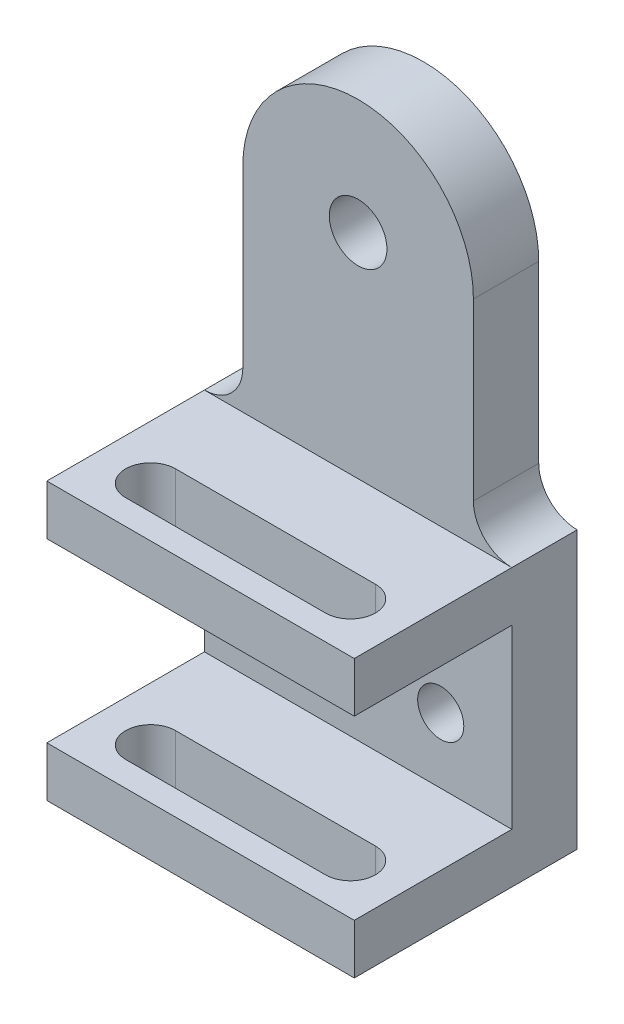
ISO-10303-21;
HEADER;
FILE_DESCRIPTION(('STEP AP214'),'2;1');
FILE_NAME('part.step','',(''),(''),'','','');
FILE_SCHEMA(('AUTOMOTIVE_DESIGN { 1 0 10303 214 1 1 1 1 }'));
ENDSEC;
DATA;
#1=APPLICATION_CONTEXT('core data for automotive mechanical design processes');
#2=APPLICATION_PROTOCOL_DEFINITION('international standard','automotive_design',2000,#1);
#3=PRODUCT_CONTEXT('',#1,'mechanical');
#4=PRODUCT('Part','Part','',(#3));
#5=PRODUCT_RELATED_PRODUCT_CATEGORY('part','',(#4));
#6=PRODUCT_DEFINITION_FORMATION('','',#4);
#7=PRODUCT_DEFINITION_CONTEXT('part definition',#1,'design');
#8=PRODUCT_DEFINITION('design','',#6,#7);
#9=PRODUCT_DEFINITION_SHAPE('','',#8);
#10=(LENGTH_UNIT() NAMED_UNIT(*) SI_UNIT(.MILLI.,.METRE.));
#11=(NAMED_UNIT(*) PLANE_ANGLE_UNIT() SI_UNIT($,.RADIAN.));
#12=(NAMED_UNIT(*) SI_UNIT($,.STERADIAN.) SOLID_ANGLE_UNIT());
#13=UNCERTAINTY_MEASURE_WITH_UNIT(LENGTH_MEASURE(1.E-05),#10,'distance_accuracy_value','');
#14=(GEOMETRIC_REPRESENTATION_CONTEXT(3) GLOBAL_UNCERTAINTY_ASSIGNED_CONTEXT((#13)) GLOBAL_UNIT_ASSIGNED_CONTEXT((#10,
#11,#12)) REPRESENTATION_CONTEXT('',''));
#15=CARTESIAN_POINT('',(0.,0.,0.));
#16=DIRECTION('',(0.,0.,1.));
#17=DIRECTION('',(1.,0.,0.));
#18=AXIS2_PLACEMENT_3D('',#15,#16,#17);
#19=CARTESIAN_POINT('',(40.,82.,-67.5));
#20=DIRECTION('',(0.,0.,1.));
#21=DIRECTION('',(1.,0.,0.));
#22=AXIS2_PLACEMENT_3D('',#19,#20,#21);
#23=CYLINDRICAL_SURFACE('',#22,10.);
#24=DIRECTION('',(0.,0.,-1.));
#25=VECTOR('',#24,1.);
#26=CARTESIAN_POINT('',(30.,82.,-67.5));
#27=LINE('',#26,#25);
#28=CARTESIAN_POINT('',(30.,82.,-12.));
#29=VERTEX_POINT('',#28);
#30=CARTESIAN_POINT('',(30.,82.,-29.));
#31=VERTEX_POINT('',#30);
#32=EDGE_CURVE('E377',#29,#31,#27,.T.);
#33=ORIENTED_EDGE('',*,*,#32,.F.);
#34=CARTESIAN_POINT('',(40.,82.,-12.));
#35=DIRECTION('',(0.,0.,-1.));
#36=DIRECTION('',(-1.,0.,0.));
#37=AXIS2_PLACEMENT_3D('',#34,#35,#36);
#38=CIRCLE('',#37,10.);
#39=CARTESIAN_POINT('',(40.,72.,-12.));
#40=VERTEX_POINT('',#39);
#41=EDGE_CURVE('E381',#29,#40,#38,.F.);
#42=ORIENTED_EDGE('',*,*,#41,.T.);
#43=DIRECTION('',(0.,0.,1.));
#44=VECTOR('',#43,1.);
#45=CARTESIAN_POINT('',(40.,72.,-29.));
#46=LINE('',#45,#44);
#47=CARTESIAN_POINT('',(40.,72.,-29.));
#48=VERTEX_POINT('',#47);
#49=EDGE_CURVE('E313',#48,#40,#46,.T.);
#50=ORIENTED_EDGE('',*,*,#49,.F.);
#51=CARTESIAN_POINT('',(40.,82.,-29.));
#52=DIRECTION('',(0.,0.,1.));
#53=DIRECTION('',(1.,0.,0.));
#54=AXIS2_PLACEMENT_3D('',#51,#52,#53);
#55=CIRCLE('',#54,10.);
#56=EDGE_CURVE('E385',#48,#31,#55,.F.);
#57=ORIENTED_EDGE('',*,*,#56,.T.);
#58=EDGE_LOOP('',(#33,#42,#50,#57));
#59=FACE_BOUND('',#58,.T.);
#60=ADVANCED_FACE('F39',(#59),#23,.F.);
#61=CARTESIAN_POINT('',(-40.,82.,-67.5));
#62=DIRECTION('',(0.,0.,-1.));
#63=DIRECTION('',(-1.,0.,0.));
#64=AXIS2_PLACEMENT_3D('',#61,#62,#63);
#65=CYLINDRICAL_SURFACE('',#64,10.);
#66=DIRECTION('',(0.,0.,1.));
#67=VECTOR('',#66,1.);
#68=CARTESIAN_POINT('',(-30.,82.,-67.5));
#69=LINE('',#68,#67);
#70=CARTESIAN_POINT('',(-30.,82.,-29.));
#71=VERTEX_POINT('',#70);
#72=CARTESIAN_POINT('',(-30.,82.,-12.));
#73=VERTEX_POINT('',#72);
#74=EDGE_CURVE('E367',#71,#73,#69,.T.);
#75=ORIENTED_EDGE('',*,*,#74,.F.);
#76=CARTESIAN_POINT('',(-40.,82.,-29.));
#77=DIRECTION('',(0.,0.,1.));
#78=DIRECTION('',(1.,0.,0.));
#79=AXIS2_PLACEMENT_3D('',#76,#77,#78);
#80=CIRCLE('',#79,10.);
#81=CARTESIAN_POINT('',(-40.,72.,-29.));
#82=VERTEX_POINT('',#81);
#83=EDGE_CURVE('E371',#71,#82,#80,.F.);
#84=ORIENTED_EDGE('',*,*,#83,.T.);
#85=DIRECTION('',(0.,0.,1.));
#86=VECTOR('',#85,1.);
#87=CARTESIAN_POINT('',(-40.,72.,-29.));
#88=LINE('',#87,#86);
#89=CARTESIAN_POINT('',(-40.,72.,-12.));
#90=VERTEX_POINT('',#89);
#91=EDGE_CURVE('E307',#82,#90,#88,.T.);
#92=ORIENTED_EDGE('',*,*,#91,.T.);
#93=CARTESIAN_POINT('',(-40.,82.,-12.));
#94=DIRECTION('',(0.,0.,-1.));
#95=DIRECTION('',(-1.,0.,0.));
#96=AXIS2_PLACEMENT_3D('',#93,#94,#95);
#97=CIRCLE('',#96,10.);
#98=EDGE_CURVE('E374',#90,#73,#97,.F.);
#99=ORIENTED_EDGE('',*,*,#98,.T.);
#100=EDGE_LOOP('',(#75,#84,#92,#99));
#101=FACE_BOUND('',#100,.T.);
#102=ADVANCED_FACE('F482',(#101),#65,.F.);
#103=CARTESIAN_POINT('',(-40.,13.,-29.));
#104=DIRECTION('',(0.,0.,1.));
#105=DIRECTION('',(1.,0.,0.));
#106=AXIS2_PLACEMENT_3D('',#103,#104,#105);
#107=PLANE('',#106);
#108=CARTESIAN_POINT('',(21.5,30.,-29.));
#109=DIRECTION('',(0.,0.,1.));
#110=DIRECTION('',(1.,0.,0.));
#111=AXIS2_PLACEMENT_3D('',#108,#109,#110);
#112=CIRCLE('',#111,6.);
#113=CARTESIAN_POINT('',(27.5,30.,-29.));
#114=VERTEX_POINT('',#113);
#115=EDGE_CURVE('E425',#114,#114,#112,.T.);
#116=ORIENTED_EDGE('',*,*,#115,.T.);
#117=EDGE_LOOP('',(#116));
#118=FACE_BOUND('',#117,.T.);
#119=CARTESIAN_POINT('',(-21.5,30.,-29.));
#120=DIRECTION('',(0.,0.,1.));
#121=DIRECTION('',(1.,0.,0.));
#122=AXIS2_PLACEMENT_3D('',#119,#120,#121);
#123=CIRCLE('',#122,6.);
#124=CARTESIAN_POINT('',(-15.5,30.,-29.));
#125=VERTEX_POINT('',#124);
#126=EDGE_CURVE('E417',#125,#125,#123,.T.);
#127=ORIENTED_EDGE('',*,*,#126,.T.);
#128=EDGE_LOOP('',(#127));
#129=FACE_BOUND('',#128,.T.);
#130=CARTESIAN_POINT('',(0.,127.5,-29.));
#131=DIRECTION('',(0.,0.,1.));
#132=DIRECTION('',(1.,0.,0.));
#133=AXIS2_PLACEMENT_3D('',#130,#131,#132);
#134=CIRCLE('',#133,7.5);
#135=CARTESIAN_POINT('',(7.49999999999999,127.5,-29.));
#136=VERTEX_POINT('',#135);
#137=EDGE_CURVE('E246',#136,#136,#134,.T.);
#138=ORIENTED_EDGE('',*,*,#137,.T.);
#139=EDGE_LOOP('',(#138));
#140=FACE_BOUND('',#139,.T.);
#141=DIRECTION('',(0.,-1.,0.));
#142=VECTOR('',#141,1.);
#143=CARTESIAN_POINT('',(-30.,13.,-29.));
#144=LINE('',#143,#142);
#145=CARTESIAN_POINT('',(-30.,127.5,-29.));
#146=VERTEX_POINT('',#145);
#147=EDGE_CURVE('E274',#146,#71,#144,.T.);
#148=ORIENTED_EDGE('',*,*,#147,.F.);
#149=CARTESIAN_POINT('',(0.,127.5,-29.));
#150=DIRECTION('',(0.,0.,1.));
#151=DIRECTION('',(1.,0.,0.));
#152=AXIS2_PLACEMENT_3D('',#149,#150,#151);
#153=CIRCLE('',#152,30.);
#154=CARTESIAN_POINT('',(30.,127.5,-29.));
#155=VERTEX_POINT('',#154);
#156=EDGE_CURVE('E254',#155,#146,#153,.T.);
#157=ORIENTED_EDGE('',*,*,#156,.F.);
#158=DIRECTION('',(0.,1.,0.));
#159=VECTOR('',#158,1.);
#160=CARTESIAN_POINT('',(30.,13.,-29.));
#161=LINE('',#160,#159);
#162=EDGE_CURVE('E267',#31,#155,#161,.T.);
#163=ORIENTED_EDGE('',*,*,#162,.F.);
#164=ORIENTED_EDGE('',*,*,#56,.F.);
#165=DIRECTION('',(0.,-1.,0.));
#166=VECTOR('',#165,1.);
#167=CARTESIAN_POINT('',(40.,13.,-29.));
#168=LINE('',#167,#166);
#169=CARTESIAN_POINT('',(40.,0.,-29.));
#170=VERTEX_POINT('',#169);
#171=EDGE_CURVE('E361',#48,#170,#168,.T.);
#172=ORIENTED_EDGE('',*,*,#171,.T.);
#173=DIRECTION('',(-1.,0.,0.));
#174=VECTOR('',#173,1.);
#175=CARTESIAN_POINT('',(-40.,0.,-29.));
#176=LINE('',#175,#174);
#177=CARTESIAN_POINT('',(-40.,0.,-29.));
#178=VERTEX_POINT('',#177);
#179=EDGE_CURVE('E342',#170,#178,#176,.T.);
#180=ORIENTED_EDGE('',*,*,#179,.T.);
#181=DIRECTION('',(0.,-1.,0.));
#182=VECTOR('',#181,1.);
#183=CARTESIAN_POINT('',(-40.,13.,-29.));
#184=LINE('',#183,#182);
#185=EDGE_CURVE('E358',#82,#178,#184,.T.);
#186=ORIENTED_EDGE('',*,*,#185,.F.);
#187=ORIENTED_EDGE('',*,*,#83,.F.);
#188=EDGE_LOOP('',(#148,#157,#163,#164,#172,#180,#186,#187));
#189=FACE_BOUND('',#188,.T.);
#190=ADVANCED_FACE('F435',(#118,#129,#140,#189),#107,.F.);
#191=CARTESIAN_POINT('',(-40.,127.5,-12.));
#192=DIRECTION('',(0.,0.,-1.));
#193=DIRECTION('',(-1.,0.,0.));
#194=AXIS2_PLACEMENT_3D('',#191,#192,#193);
#195=PLANE('',#194);
#196=CARTESIAN_POINT('',(0.,127.5,-12.));
#197=DIRECTION('',(0.,0.,1.));
#198=DIRECTION('',(1.,0.,0.));
#199=AXIS2_PLACEMENT_3D('',#196,#197,#198);
#200=CIRCLE('',#199,7.5);
#201=CARTESIAN_POINT('',(7.49999999999999,127.5,-12.));
#202=VERTEX_POINT('',#201);
#203=EDGE_CURVE('E236',#202,#202,#200,.T.);
#204=ORIENTED_EDGE('',*,*,#203,.F.);
#205=EDGE_LOOP('',(#204));
#206=FACE_BOUND('',#205,.T.);
#207=DIRECTION('',(1.,0.,0.));
#208=VECTOR('',#207,1.);
#209=CARTESIAN_POINT('',(-40.,72.,-12.));
#210=LINE('',#209,#208);
#211=EDGE_CURVE('E278',#90,#40,#210,.T.);
#212=ORIENTED_EDGE('',*,*,#211,.T.);
#213=ORIENTED_EDGE('',*,*,#41,.F.);
#214=DIRECTION('',(0.,1.,0.));
#215=VECTOR('',#214,1.);
#216=CARTESIAN_POINT('',(30.,72.,-12.));
#217=LINE('',#216,#215);
#218=CARTESIAN_POINT('',(30.,127.5,-12.));
#219=VERTEX_POINT('',#218);
#220=EDGE_CURVE('E257',#29,#219,#217,.T.);
#221=ORIENTED_EDGE('',*,*,#220,.T.);
#222=CARTESIAN_POINT('',(0.,127.5,-12.));
#223=DIRECTION('',(0.,0.,1.));
#224=DIRECTION('',(1.,0.,0.));
#225=AXIS2_PLACEMENT_3D('',#222,#223,#224);
#226=CIRCLE('',#225,30.);
#227=CARTESIAN_POINT('',(-30.,127.5,-12.));
#228=VERTEX_POINT('',#227);
#229=EDGE_CURVE('E250',#219,#228,#226,.T.);
#230=ORIENTED_EDGE('',*,*,#229,.T.);
#231=DIRECTION('',(0.,-1.,0.));
#232=VECTOR('',#231,1.);
#233=CARTESIAN_POINT('',(-30.,127.5,-12.));
#234=LINE('',#233,#232);
#235=EDGE_CURVE('E270',#228,#73,#234,.T.);
#236=ORIENTED_EDGE('',*,*,#235,.T.);
#237=ORIENTED_EDGE('',*,*,#98,.F.);
#238=EDGE_LOOP('',(#212,#213,#221,#230,#236,#237));
#239=FACE_BOUND('',#238,.T.);
#240=ADVANCED_FACE('F501',(#206,#239),#195,.F.);
#241=CARTESIAN_POINT('',(40.,13.,-29.));
#242=DIRECTION('',(-1.,0.,0.));
#243=DIRECTION('',(0.,0.,1.));
#244=AXIS2_PLACEMENT_3D('',#241,#242,#243);
#245=PLANE('',#244);
#246=ORIENTED_EDGE('',*,*,#171,.F.);
#247=ORIENTED_EDGE('',*,*,#49,.T.);
#248=CARTESIAN_POINT('',(40.,72.,29.));
#249=VERTEX_POINT('',#248);
#250=EDGE_CURVE('E311',#40,#249,#46,.T.);
#251=ORIENTED_EDGE('',*,*,#250,.T.);
#252=DIRECTION('',(0.,-1.,0.));
#253=VECTOR('',#252,1.);
#254=CARTESIAN_POINT('',(40.,72.,29.));
#255=LINE('',#254,#253);
#256=CARTESIAN_POINT('',(40.,59.,29.));
#257=VERTEX_POINT('',#256);
#258=EDGE_CURVE('E289',#249,#257,#255,.T.);
#259=ORIENTED_EDGE('',*,*,#258,.T.);
#260=DIRECTION('',(0.,0.,-1.));
#261=VECTOR('',#260,1.);
#262=CARTESIAN_POINT('',(40.,59.,29.));
#263=LINE('',#262,#261);
#264=CARTESIAN_POINT('',(40.,59.,-12.));
#265=VERTEX_POINT('',#264);
#266=EDGE_CURVE('E297',#257,#265,#263,.T.);
#267=ORIENTED_EDGE('',*,*,#266,.T.);
#268=DIRECTION('',(0.,-1.,0.));
#269=VECTOR('',#268,1.);
#270=CARTESIAN_POINT('',(40.,72.,-12.));
#271=LINE('',#270,#269);
#272=CARTESIAN_POINT('',(40.,13.,-12.));
#273=VERTEX_POINT('',#272);
#274=EDGE_CURVE('E317',#265,#273,#271,.T.);
#275=ORIENTED_EDGE('',*,*,#274,.T.);
#276=DIRECTION('',(0.,0.,-1.));
#277=VECTOR('',#276,1.);
#278=CARTESIAN_POINT('',(40.,13.,-29.));
#279=LINE('',#278,#277);
#280=CARTESIAN_POINT('',(40.,13.,29.));
#281=VERTEX_POINT('',#280);
#282=EDGE_CURVE('E327',#281,#273,#279,.T.);
#283=ORIENTED_EDGE('',*,*,#282,.F.);
#284=DIRECTION('',(0.,-1.,0.));
#285=VECTOR('',#284,1.);
#286=CARTESIAN_POINT('',(40.,13.,29.));
#287=LINE('',#286,#285);
#288=CARTESIAN_POINT('',(40.,0.,29.));
#289=VERTEX_POINT('',#288);
#290=EDGE_CURVE('E338',#281,#289,#287,.T.);
#291=ORIENTED_EDGE('',*,*,#290,.T.);
#292=DIRECTION('',(0.,0.,-1.));
#293=VECTOR('',#292,1.);
#294=CARTESIAN_POINT('',(40.,0.,-29.));
#295=LINE('',#294,#293);
#296=EDGE_CURVE('E326',#289,#170,#295,.T.);
#297=ORIENTED_EDGE('',*,*,#296,.T.);
#298=EDGE_LOOP('',(#246,#247,#251,#259,#267,#275,#283,#291,#297));
#299=FACE_BOUND('',#298,.T.);
#300=ADVANCED_FACE('F471',(#299),#245,.F.);
#301=CARTESIAN_POINT('',(-40.,13.,-29.));
#302=DIRECTION('',(1.,0.,0.));
#303=DIRECTION('',(0.,0.,-1.));
#304=AXIS2_PLACEMENT_3D('',#301,#302,#303);
#305=PLANE('',#304);
#306=ORIENTED_EDGE('',*,*,#91,.F.);
#307=ORIENTED_EDGE('',*,*,#185,.T.);
#308=DIRECTION('',(0.,0.,1.));
#309=VECTOR('',#308,1.);
#310=CARTESIAN_POINT('',(-40.,0.,-29.));
#311=LINE('',#310,#309);
#312=CARTESIAN_POINT('',(-40.,0.,29.));
#313=VERTEX_POINT('',#312);
#314=EDGE_CURVE('E346',#178,#313,#311,.T.);
#315=ORIENTED_EDGE('',*,*,#314,.T.);
#316=DIRECTION('',(0.,-1.,0.));
#317=VECTOR('',#316,1.);
#318=CARTESIAN_POINT('',(-40.,13.,29.));
#319=LINE('',#318,#317);
#320=CARTESIAN_POINT('',(-40.,13.,29.));
#321=VERTEX_POINT('',#320);
#322=EDGE_CURVE('E354',#321,#313,#319,.T.);
#323=ORIENTED_EDGE('',*,*,#322,.F.);
#324=DIRECTION('',(0.,0.,1.));
#325=VECTOR('',#324,1.);
#326=CARTESIAN_POINT('',(-40.,13.,-29.));
#327=LINE('',#326,#325);
#328=CARTESIAN_POINT('',(-40.,13.,-12.));
#329=VERTEX_POINT('',#328);
#330=EDGE_CURVE('E331',#329,#321,#327,.T.);
#331=ORIENTED_EDGE('',*,*,#330,.F.);
#332=DIRECTION('',(0.,-1.,0.));
#333=VECTOR('',#332,1.);
#334=CARTESIAN_POINT('',(-40.,72.,-12.));
#335=LINE('',#334,#333);
#336=CARTESIAN_POINT('',(-40.,59.,-12.));
#337=VERTEX_POINT('',#336);
#338=EDGE_CURVE('E323',#337,#329,#335,.T.);
#339=ORIENTED_EDGE('',*,*,#338,.F.);
#340=DIRECTION('',(0.,0.,-1.));
#341=VECTOR('',#340,1.);
#342=CARTESIAN_POINT('',(-40.,59.,29.));
#343=LINE('',#342,#341);
#344=CARTESIAN_POINT('',(-40.,59.,29.));
#345=VERTEX_POINT('',#344);
#346=EDGE_CURVE('E303',#345,#337,#343,.T.);
#347=ORIENTED_EDGE('',*,*,#346,.F.);
#348=DIRECTION('',(0.,-1.,0.));
#349=VECTOR('',#348,1.);
#350=CARTESIAN_POINT('',(-40.,72.,29.));
#351=LINE('',#350,#349);
#352=CARTESIAN_POINT('',(-40.,72.,29.));
#353=VERTEX_POINT('',#352);
#354=EDGE_CURVE('E282',#353,#345,#351,.T.);
#355=ORIENTED_EDGE('',*,*,#354,.F.);
#356=EDGE_CURVE('E312',#90,#353,#88,.T.);
#357=ORIENTED_EDGE('',*,*,#356,.F.);
#358=EDGE_LOOP('',(#306,#307,#315,#323,#331,#339,#347,#355,#357));
#359=FACE_BOUND('',#358,.T.);
#360=ADVANCED_FACE('F449',(#359),#305,.F.);
#361=CARTESIAN_POINT('',(-40.,72.,-12.));
#362=DIRECTION('',(0.,0.,-1.));
#363=DIRECTION('',(-1.,0.,0.));
#364=AXIS2_PLACEMENT_3D('',#361,#362,#363);
#365=PLANE('',#364);
#366=CARTESIAN_POINT('',(21.5,30.,-12.));
#367=DIRECTION('',(0.,0.,1.));
#368=DIRECTION('',(1.,0.,0.));
#369=AXIS2_PLACEMENT_3D('',#366,#367,#368);
#370=CIRCLE('',#369,6.);
#371=CARTESIAN_POINT('',(27.5,30.,-12.));
#372=VERTEX_POINT('',#371);
#373=EDGE_CURVE('E427',#372,#372,#370,.T.);
#374=ORIENTED_EDGE('',*,*,#373,.F.);
#375=EDGE_LOOP('',(#374));
#376=FACE_BOUND('',#375,.T.);
#377=CARTESIAN_POINT('',(-21.5,30.,-12.));
#378=DIRECTION('',(0.,0.,1.));
#379=DIRECTION('',(1.,0.,0.));
#380=AXIS2_PLACEMENT_3D('',#377,#378,#379);
#381=CIRCLE('',#380,6.);
#382=CARTESIAN_POINT('',(-15.5,30.,-12.));
#383=VERTEX_POINT('',#382);
#384=EDGE_CURVE('E420',#383,#383,#381,.T.);
#385=ORIENTED_EDGE('',*,*,#384,.F.);
#386=EDGE_LOOP('',(#385));
#387=FACE_BOUND('',#386,.T.);
#388=DIRECTION('',(1.,0.,0.));
#389=VECTOR('',#388,1.);
#390=CARTESIAN_POINT('',(-40.,59.,-12.));
#391=LINE('',#390,#389);
#392=EDGE_CURVE('E281',#337,#265,#391,.T.);
#393=ORIENTED_EDGE('',*,*,#392,.F.);
#394=ORIENTED_EDGE('',*,*,#338,.T.);
#395=DIRECTION('',(1.,0.,0.));
#396=VECTOR('',#395,1.);
#397=CARTESIAN_POINT('',(-40.,13.,-12.));
#398=LINE('',#397,#396);
#399=EDGE_CURVE('E306',#329,#273,#398,.T.);
#400=ORIENTED_EDGE('',*,*,#399,.T.);
#401=ORIENTED_EDGE('',*,*,#274,.F.);
#402=EDGE_LOOP('',(#393,#394,#400,#401));
#403=FACE_BOUND('',#402,.T.);
#404=ADVANCED_FACE('F445',(#376,#387,#403),#365,.F.);
#405=CARTESIAN_POINT('',(-40.,13.,29.));
#406=DIRECTION('',(0.,0.,-1.));
#407=DIRECTION('',(-1.,0.,0.));
#408=AXIS2_PLACEMENT_3D('',#405,#406,#407);
#409=PLANE('',#408);
#410=DIRECTION('',(1.,0.,0.));
#411=VECTOR('',#410,1.);
#412=CARTESIAN_POINT('',(-40.,0.,29.));
#413=LINE('',#412,#411);
#414=EDGE_CURVE('E332',#313,#289,#413,.T.);
#415=ORIENTED_EDGE('',*,*,#414,.T.);
#416=ORIENTED_EDGE('',*,*,#290,.F.);
#417=DIRECTION('',(1.,0.,0.));
#418=VECTOR('',#417,1.);
#419=CARTESIAN_POINT('',(-40.,13.,29.));
#420=LINE('',#419,#418);
#421=EDGE_CURVE('E335',#321,#281,#420,.T.);
#422=ORIENTED_EDGE('',*,*,#421,.F.);
#423=ORIENTED_EDGE('',*,*,#322,.T.);
#424=EDGE_LOOP('',(#415,#416,#422,#423));
#425=FACE_BOUND('',#424,.T.);
#426=ADVANCED_FACE('F448',(#425),#409,.F.);
#427=CARTESIAN_POINT('',(0.,13.,0.));
#428=DIRECTION('',(0.,1.,0.));
#429=DIRECTION('',(0.,0.,1.));
#430=AXIS2_PLACEMENT_3D('',#427,#428,#429);
#431=PLANE('',#430);
#432=CARTESIAN_POINT('',(-26.,13.,16.));
#433=DIRECTION('',(0.,1.,0.));
#434=DIRECTION('',(0.,0.,1.));
#435=AXIS2_PLACEMENT_3D('',#432,#433,#434);
#436=CIRCLE('',#435,6.5);
#437=CARTESIAN_POINT('',(-26.,13.,9.5));
#438=VERTEX_POINT('',#437);
#439=CARTESIAN_POINT('',(-26.,13.,22.5));
#440=VERTEX_POINT('',#439);
#441=EDGE_CURVE('E213',#438,#440,#436,.T.);
#442=ORIENTED_EDGE('',*,*,#441,.F.);
#443=DIRECTION('',(1.,0.,0.));
#444=VECTOR('',#443,1.);
#445=CARTESIAN_POINT('',(-26.,13.,9.5));
#446=LINE('',#445,#444);
#447=CARTESIAN_POINT('',(26.,13.,9.5));
#448=VERTEX_POINT('',#447);
#449=EDGE_CURVE('E228',#438,#448,#446,.T.);
#450=ORIENTED_EDGE('',*,*,#449,.T.);
#451=CARTESIAN_POINT('',(26.,13.,16.));
#452=DIRECTION('',(0.,1.,0.));
#453=DIRECTION('',(0.,0.,1.));
#454=AXIS2_PLACEMENT_3D('',#451,#452,#453);
#455=CIRCLE('',#454,6.5);
#456=CARTESIAN_POINT('',(26.,13.,22.5));
#457=VERTEX_POINT('',#456);
#458=EDGE_CURVE('E224',#457,#448,#455,.T.);
#459=ORIENTED_EDGE('',*,*,#458,.F.);
#460=DIRECTION('',(1.,0.,0.));
#461=VECTOR('',#460,1.);
#462=CARTESIAN_POINT('',(-26.,13.,22.5));
#463=LINE('',#462,#461);
#464=EDGE_CURVE('E220',#440,#457,#463,.T.);
#465=ORIENTED_EDGE('',*,*,#464,.F.);
#466=EDGE_LOOP('',(#442,#450,#459,#465));
#467=FACE_BOUND('',#466,.T.);
#468=ORIENTED_EDGE('',*,*,#399,.F.);
#469=ORIENTED_EDGE('',*,*,#330,.T.);
#470=ORIENTED_EDGE('',*,*,#421,.T.);
#471=ORIENTED_EDGE('',*,*,#282,.T.);
#472=EDGE_LOOP('',(#468,#469,#470,#471));
#473=FACE_BOUND('',#472,.T.);
#474=ADVANCED_FACE('F466',(#467,#473),#431,.T.);
#475=CARTESIAN_POINT('',(0.,0.,0.));
#476=DIRECTION('',(0.,1.,0.));
#477=DIRECTION('',(0.,0.,1.));
#478=AXIS2_PLACEMENT_3D('',#475,#476,#477);
#479=PLANE('',#478);
#480=DIRECTION('',(1.,0.,0.));
#481=VECTOR('',#480,1.);
#482=CARTESIAN_POINT('',(0.,0.,9.5));
#483=LINE('',#482,#481);
#484=CARTESIAN_POINT('',(-26.,0.,9.5));
#485=VERTEX_POINT('',#484);
#486=CARTESIAN_POINT('',(26.,0.,9.5));
#487=VERTEX_POINT('',#486);
#488=EDGE_CURVE('E396',#485,#487,#483,.T.);
#489=ORIENTED_EDGE('',*,*,#488,.F.);
#490=CARTESIAN_POINT('',(-26.,0.,16.));
#491=DIRECTION('',(0.,1.,0.));
#492=DIRECTION('',(0.,0.,1.));
#493=AXIS2_PLACEMENT_3D('',#490,#491,#492);
#494=CIRCLE('',#493,6.5);
#495=CARTESIAN_POINT('',(-26.,0.,22.5));
#496=VERTEX_POINT('',#495);
#497=EDGE_CURVE('E399',#485,#496,#494,.T.);
#498=ORIENTED_EDGE('',*,*,#497,.T.);
#499=DIRECTION('',(1.,0.,0.));
#500=VECTOR('',#499,1.);
#501=CARTESIAN_POINT('',(0.,0.,22.5));
#502=LINE('',#501,#500);
#503=CARTESIAN_POINT('',(26.,0.,22.5));
#504=VERTEX_POINT('',#503);
#505=EDGE_CURVE('E388',#496,#504,#502,.T.);
#506=ORIENTED_EDGE('',*,*,#505,.T.);
#507=CARTESIAN_POINT('',(26.,0.,16.));
#508=DIRECTION('',(0.,1.,0.));
#509=DIRECTION('',(0.,0.,1.));
#510=AXIS2_PLACEMENT_3D('',#507,#508,#509);
#511=CIRCLE('',#510,6.5);
#512=EDGE_CURVE('E392',#504,#487,#511,.T.);
#513=ORIENTED_EDGE('',*,*,#512,.T.);
#514=EDGE_LOOP('',(#489,#498,#506,#513));
#515=FACE_BOUND('',#514,.T.);
#516=ORIENTED_EDGE('',*,*,#296,.F.);
#517=ORIENTED_EDGE('',*,*,#414,.F.);
#518=ORIENTED_EDGE('',*,*,#314,.F.);
#519=ORIENTED_EDGE('',*,*,#179,.F.);
#520=EDGE_LOOP('',(#516,#517,#518,#519));
#521=FACE_BOUND('',#520,.T.);
#522=ADVANCED_FACE('F492',(#515,#521),#479,.F.);
#523=CARTESIAN_POINT('',(0.,72.,0.));
#524=DIRECTION('',(0.,1.,0.));
#525=DIRECTION('',(0.,0.,1.));
#526=AXIS2_PLACEMENT_3D('',#523,#524,#525);
#527=PLANE('',#526);
#528=CARTESIAN_POINT('',(-26.,72.,16.));
#529=DIRECTION('',(0.,1.,0.));
#530=DIRECTION('',(0.,0.,1.));
#531=AXIS2_PLACEMENT_3D('',#528,#529,#530);
#532=CIRCLE('',#531,6.5);
#533=CARTESIAN_POINT('',(-26.,72.,9.5));
#534=VERTEX_POINT('',#533);
#535=CARTESIAN_POINT('',(-26.,72.,22.5));
#536=VERTEX_POINT('',#535);
#537=EDGE_CURVE('E54',#534,#536,#532,.T.);
#538=ORIENTED_EDGE('',*,*,#537,.F.);
#539=DIRECTION('',(1.,0.,0.));
#540=VECTOR('',#539,1.);
#541=CARTESIAN_POINT('',(-26.,72.,9.5));
#542=LINE('',#541,#540);
#543=CARTESIAN_POINT('',(26.,72.,9.5));
#544=VERTEX_POINT('',#543);
#545=EDGE_CURVE('E203',#534,#544,#542,.T.);
#546=ORIENTED_EDGE('',*,*,#545,.T.);
#547=CARTESIAN_POINT('',(26.,72.,16.));
#548=DIRECTION('',(0.,1.,0.));
#549=DIRECTION('',(0.,0.,1.));
#550=AXIS2_PLACEMENT_3D('',#547,#548,#549);
#551=CIRCLE('',#550,6.5);
#552=CARTESIAN_POINT('',(26.,72.,22.5));
#553=VERTEX_POINT('',#552);
#554=EDGE_CURVE('E185',#553,#544,#551,.T.);
#555=ORIENTED_EDGE('',*,*,#554,.F.);
#556=DIRECTION('',(1.,0.,0.));
#557=VECTOR('',#556,1.);
#558=CARTESIAN_POINT('',(-26.,72.,22.5));
#559=LINE('',#558,#557);
#560=EDGE_CURVE('E195',#536,#553,#559,.T.);
#561=ORIENTED_EDGE('',*,*,#560,.F.);
#562=EDGE_LOOP('',(#538,#546,#555,#561));
#563=FACE_BOUND('',#562,.T.);
#564=ORIENTED_EDGE('',*,*,#250,.F.);
#565=ORIENTED_EDGE('',*,*,#211,.F.);
#566=ORIENTED_EDGE('',*,*,#356,.T.);
#567=DIRECTION('',(1.,0.,0.));
#568=VECTOR('',#567,1.);
#569=CARTESIAN_POINT('',(-40.,72.,29.));
#570=LINE('',#569,#568);
#571=EDGE_CURVE('E293',#353,#249,#570,.T.);
#572=ORIENTED_EDGE('',*,*,#571,.T.);
#573=EDGE_LOOP('',(#564,#565,#566,#572));
#574=FACE_BOUND('',#573,.T.);
#575=ADVANCED_FACE('F200',(#563,#574),#527,.T.);
#576=CARTESIAN_POINT('',(-40.,59.,29.));
#577=DIRECTION('',(0.,1.,0.));
#578=DIRECTION('',(0.,0.,1.));
#579=AXIS2_PLACEMENT_3D('',#576,#577,#578);
#580=PLANE('',#579);
#581=DIRECTION('',(1.,0.,0.));
#582=VECTOR('',#581,1.);
#583=CARTESIAN_POINT('',(-40.,59.,9.5));
#584=LINE('',#583,#582);
#585=CARTESIAN_POINT('',(-26.,59.,9.5));
#586=VERTEX_POINT('',#585);
#587=CARTESIAN_POINT('',(26.,59.,9.5));
#588=VERTEX_POINT('',#587);
#589=EDGE_CURVE('E47',#586,#588,#584,.T.);
#590=ORIENTED_EDGE('',*,*,#589,.F.);
#591=CARTESIAN_POINT('',(-26.,59.,16.));
#592=DIRECTION('',(0.,1.,0.));
#593=DIRECTION('',(0.,0.,1.));
#594=AXIS2_PLACEMENT_3D('',#591,#592,#593);
#595=CIRCLE('',#594,6.5);
#596=CARTESIAN_POINT('',(-26.,59.,22.5));
#597=VERTEX_POINT('',#596);
#598=EDGE_CURVE('E11',#586,#597,#595,.T.);
#599=ORIENTED_EDGE('',*,*,#598,.T.);
#600=DIRECTION('',(1.,0.,0.));
#601=VECTOR('',#600,1.);
#602=CARTESIAN_POINT('',(-40.,59.,22.5));
#603=LINE('',#602,#601);
#604=CARTESIAN_POINT('',(26.,59.,22.5));
#605=VERTEX_POINT('',#604);
#606=EDGE_CURVE('E403',#597,#605,#603,.T.);
#607=ORIENTED_EDGE('',*,*,#606,.T.);
#608=CARTESIAN_POINT('',(26.,59.,16.));
#609=DIRECTION('',(0.,1.,0.));
#610=DIRECTION('',(0.,0.,1.));
#611=AXIS2_PLACEMENT_3D('',#608,#609,#610);
#612=CIRCLE('',#611,6.5);
#613=EDGE_CURVE('E188',#605,#588,#612,.T.);
#614=ORIENTED_EDGE('',*,*,#613,.T.);
#615=EDGE_LOOP('',(#590,#599,#607,#614));
#616=FACE_BOUND('',#615,.T.);
#617=ORIENTED_EDGE('',*,*,#392,.T.);
#618=ORIENTED_EDGE('',*,*,#266,.F.);
#619=DIRECTION('',(1.,0.,0.));
#620=VECTOR('',#619,1.);
#621=CARTESIAN_POINT('',(-40.,59.,29.));
#622=LINE('',#621,#620);
#623=EDGE_CURVE('E286',#345,#257,#622,.T.);
#624=ORIENTED_EDGE('',*,*,#623,.F.);
#625=ORIENTED_EDGE('',*,*,#346,.T.);
#626=EDGE_LOOP('',(#617,#618,#624,#625));
#627=FACE_BOUND('',#626,.T.);
#628=ADVANCED_FACE('F413',(#616,#627),#580,.F.);
#629=CARTESIAN_POINT('',(0.,0.,29.));
#630=DIRECTION('',(0.,0.,1.));
#631=DIRECTION('',(1.,0.,0.));
#632=AXIS2_PLACEMENT_3D('',#629,#630,#631);
#633=PLANE('',#632);
#634=ORIENTED_EDGE('',*,*,#354,.T.);
#635=ORIENTED_EDGE('',*,*,#623,.T.);
#636=ORIENTED_EDGE('',*,*,#258,.F.);
#637=ORIENTED_EDGE('',*,*,#571,.F.);
#638=EDGE_LOOP('',(#634,#635,#636,#637));
#639=FACE_BOUND('',#638,.T.);
#640=ADVANCED_FACE('F476',(#639),#633,.T.);
#641=CARTESIAN_POINT('',(-30.,127.5,-67.5));
#642=DIRECTION('',(-1.,0.,0.));
#643=DIRECTION('',(0.,0.,1.));
#644=AXIS2_PLACEMENT_3D('',#641,#642,#643);
#645=PLANE('',#644);
#646=ORIENTED_EDGE('',*,*,#147,.T.);
#647=ORIENTED_EDGE('',*,*,#74,.T.);
#648=ORIENTED_EDGE('',*,*,#235,.F.);
#649=DIRECTION('',(0.,0.,1.));
#650=VECTOR('',#649,1.);
#651=CARTESIAN_POINT('',(-30.,127.5,0.));
#652=LINE('',#651,#650);
#653=EDGE_CURVE('E364',#146,#228,#652,.T.);
#654=ORIENTED_EDGE('',*,*,#653,.F.);
#655=EDGE_LOOP('',(#646,#647,#648,#654));
#656=FACE_BOUND('',#655,.T.);
#657=ADVANCED_FACE('F506',(#656),#645,.T.);
#658=CARTESIAN_POINT('',(30.,72.,-67.5));
#659=DIRECTION('',(1.,0.,0.));
#660=DIRECTION('',(0.,0.,-1.));
#661=AXIS2_PLACEMENT_3D('',#658,#659,#660);
#662=PLANE('',#661);
#663=ORIENTED_EDGE('',*,*,#220,.F.);
#664=ORIENTED_EDGE('',*,*,#32,.T.);
#665=ORIENTED_EDGE('',*,*,#162,.T.);
#666=DIRECTION('',(0.,0.,1.));
#667=VECTOR('',#666,1.);
#668=CARTESIAN_POINT('',(30.,127.5,-67.5));
#669=LINE('',#668,#667);
#670=EDGE_CURVE('E263',#155,#219,#669,.T.);
#671=ORIENTED_EDGE('',*,*,#670,.T.);
#672=EDGE_LOOP('',(#663,#664,#665,#671));
#673=FACE_BOUND('',#672,.T.);
#674=ADVANCED_FACE('F511',(#673),#662,.T.);
#675=CARTESIAN_POINT('',(0.,127.5,-29.));
#676=DIRECTION('',(0.,0.,1.));
#677=DIRECTION('',(1.,0.,0.));
#678=AXIS2_PLACEMENT_3D('',#675,#676,#677);
#679=CYLINDRICAL_SURFACE('',#678,30.);
#680=ORIENTED_EDGE('',*,*,#156,.T.);
#681=ORIENTED_EDGE('',*,*,#653,.T.);
#682=ORIENTED_EDGE('',*,*,#229,.F.);
#683=ORIENTED_EDGE('',*,*,#670,.F.);
#684=EDGE_LOOP('',(#680,#681,#682,#683));
#685=FACE_BOUND('',#684,.T.);
#686=ADVANCED_FACE('F508',(#685),#679,.T.);
#687=CARTESIAN_POINT('',(0.,127.5,-29.));
#688=DIRECTION('',(0.,0.,1.));
#689=DIRECTION('',(1.,0.,0.));
#690=AXIS2_PLACEMENT_3D('',#687,#688,#689);
#691=CYLINDRICAL_SURFACE('',#690,7.5);
#692=ORIENTED_EDGE('',*,*,#137,.F.);
#693=EDGE_LOOP('',(#692));
#694=FACE_BOUND('',#693,.T.);
#695=ORIENTED_EDGE('',*,*,#203,.T.);
#696=EDGE_LOOP('',(#695));
#697=FACE_BOUND('',#696,.T.);
#698=ADVANCED_FACE('F518',(#694,#697),#691,.F.);
#699=CARTESIAN_POINT('',(-26.,-4.,16.));
#700=DIRECTION('',(0.,1.,0.));
#701=DIRECTION('',(0.,0.,1.));
#702=AXIS2_PLACEMENT_3D('',#699,#700,#701);
#703=CYLINDRICAL_SURFACE('',#702,6.5);
#704=DIRECTION('',(0.,1.,0.));
#705=VECTOR('',#704,1.);
#706=CARTESIAN_POINT('',(-26.,-4.,9.5));
#707=LINE('',#706,#705);
#708=EDGE_CURVE('E233',#485,#438,#707,.T.);
#709=ORIENTED_EDGE('',*,*,#708,.T.);
#710=ORIENTED_EDGE('',*,*,#441,.T.);
#711=DIRECTION('',(0.,1.,0.));
#712=VECTOR('',#711,1.);
#713=CARTESIAN_POINT('',(-26.,-4.,22.5));
#714=LINE('',#713,#712);
#715=EDGE_CURVE('E232',#496,#440,#714,.T.);
#716=ORIENTED_EDGE('',*,*,#715,.F.);
#717=ORIENTED_EDGE('',*,*,#497,.F.);
#718=EDGE_LOOP('',(#709,#710,#716,#717));
#719=FACE_BOUND('',#718,.T.);
#720=ADVANCED_FACE('F555',(#719),#703,.F.);
#721=CARTESIAN_POINT('',(-26.,-4.,9.5));
#722=DIRECTION('',(0.,0.,1.));
#723=DIRECTION('',(1.,0.,0.));
#724=AXIS2_PLACEMENT_3D('',#721,#722,#723);
#725=PLANE('',#724);
#726=ORIENTED_EDGE('',*,*,#488,.T.);
#727=DIRECTION('',(0.,1.,0.));
#728=VECTOR('',#727,1.);
#729=CARTESIAN_POINT('',(26.,-4.,9.5));
#730=LINE('',#729,#728);
#731=EDGE_CURVE('E237',#487,#448,#730,.T.);
#732=ORIENTED_EDGE('',*,*,#731,.T.);
#733=ORIENTED_EDGE('',*,*,#449,.F.);
#734=ORIENTED_EDGE('',*,*,#708,.F.);
#735=EDGE_LOOP('',(#726,#732,#733,#734));
#736=FACE_BOUND('',#735,.T.);
#737=ADVANCED_FACE('F561',(#736),#725,.T.);
#738=CARTESIAN_POINT('',(26.,-4.,16.));
#739=DIRECTION('',(0.,1.,0.));
#740=DIRECTION('',(0.,0.,1.));
#741=AXIS2_PLACEMENT_3D('',#738,#739,#740);
#742=CYLINDRICAL_SURFACE('',#741,6.5);
#743=DIRECTION('',(0.,1.,0.));
#744=VECTOR('',#743,1.);
#745=CARTESIAN_POINT('',(26.,-4.,22.5));
#746=LINE('',#745,#744);
#747=EDGE_CURVE('E240',#504,#457,#746,.T.);
#748=ORIENTED_EDGE('',*,*,#747,.T.);
#749=ORIENTED_EDGE('',*,*,#458,.T.);
#750=ORIENTED_EDGE('',*,*,#731,.F.);
#751=ORIENTED_EDGE('',*,*,#512,.F.);
#752=EDGE_LOOP('',(#748,#749,#750,#751));
#753=FACE_BOUND('',#752,.T.);
#754=ADVANCED_FACE('F569',(#753),#742,.F.);
#755=CARTESIAN_POINT('',(-26.,-4.,22.5));
#756=DIRECTION('',(0.,0.,1.));
#757=DIRECTION('',(1.,0.,0.));
#758=AXIS2_PLACEMENT_3D('',#755,#756,#757);
#759=PLANE('',#758);
#760=ORIENTED_EDGE('',*,*,#715,.T.);
#761=ORIENTED_EDGE('',*,*,#464,.T.);
#762=ORIENTED_EDGE('',*,*,#747,.F.);
#763=ORIENTED_EDGE('',*,*,#505,.F.);
#764=EDGE_LOOP('',(#760,#761,#762,#763));
#765=FACE_BOUND('',#764,.T.);
#766=ADVANCED_FACE('F566',(#765),#759,.F.);
#767=CARTESIAN_POINT('',(-26.,55.,16.));
#768=DIRECTION('',(0.,1.,0.));
#769=DIRECTION('',(0.,0.,1.));
#770=AXIS2_PLACEMENT_3D('',#767,#768,#769);
#771=CYLINDRICAL_SURFACE('',#770,6.5);
#772=DIRECTION('',(0.,1.,0.));
#773=VECTOR('',#772,1.);
#774=CARTESIAN_POINT('',(-26.,55.,9.5));
#775=LINE('',#774,#773);
#776=EDGE_CURVE('E210',#586,#534,#775,.T.);
#777=ORIENTED_EDGE('',*,*,#776,.T.);
#778=ORIENTED_EDGE('',*,*,#537,.T.);
#779=DIRECTION('',(0.,1.,0.));
#780=VECTOR('',#779,1.);
#781=CARTESIAN_POINT('',(-26.,55.,22.5));
#782=LINE('',#781,#780);
#783=EDGE_CURVE('E192',#597,#536,#782,.T.);
#784=ORIENTED_EDGE('',*,*,#783,.F.);
#785=ORIENTED_EDGE('',*,*,#598,.F.);
#786=EDGE_LOOP('',(#777,#778,#784,#785));
#787=FACE_BOUND('',#786,.T.);
#788=ADVANCED_FACE('F415',(#787),#771,.F.);
#789=CARTESIAN_POINT('',(-26.,55.,9.5));
#790=DIRECTION('',(0.,0.,1.));
#791=DIRECTION('',(1.,0.,0.));
#792=AXIS2_PLACEMENT_3D('',#789,#790,#791);
#793=PLANE('',#792);
#794=ORIENTED_EDGE('',*,*,#589,.T.);
#795=DIRECTION('',(0.,1.,0.));
#796=VECTOR('',#795,1.);
#797=CARTESIAN_POINT('',(26.,55.,9.5));
#798=LINE('',#797,#796);
#799=EDGE_CURVE('E191',#588,#544,#798,.T.);
#800=ORIENTED_EDGE('',*,*,#799,.T.);
#801=ORIENTED_EDGE('',*,*,#545,.F.);
#802=ORIENTED_EDGE('',*,*,#776,.F.);
#803=EDGE_LOOP('',(#794,#800,#801,#802));
#804=FACE_BOUND('',#803,.T.);
#805=ADVANCED_FACE('F411',(#804),#793,.T.);
#806=CARTESIAN_POINT('',(26.,55.,16.));
#807=DIRECTION('',(0.,1.,0.));
#808=DIRECTION('',(0.,0.,1.));
#809=AXIS2_PLACEMENT_3D('',#806,#807,#808);
#810=CYLINDRICAL_SURFACE('',#809,6.5);
#811=DIRECTION('',(0.,1.,0.));
#812=VECTOR('',#811,1.);
#813=CARTESIAN_POINT('',(26.,55.,22.5));
#814=LINE('',#813,#812);
#815=EDGE_CURVE('E62',#605,#553,#814,.T.);
#816=ORIENTED_EDGE('',*,*,#815,.T.);
#817=ORIENTED_EDGE('',*,*,#554,.T.);
#818=ORIENTED_EDGE('',*,*,#799,.F.);
#819=ORIENTED_EDGE('',*,*,#613,.F.);
#820=EDGE_LOOP('',(#816,#817,#818,#819));
#821=FACE_BOUND('',#820,.T.);
#822=ADVANCED_FACE('F182',(#821),#810,.F.);
#823=CARTESIAN_POINT('',(-26.,55.,22.5));
#824=DIRECTION('',(0.,0.,1.));
#825=DIRECTION('',(1.,0.,0.));
#826=AXIS2_PLACEMENT_3D('',#823,#824,#825);
#827=PLANE('',#826);
#828=ORIENTED_EDGE('',*,*,#783,.T.);
#829=ORIENTED_EDGE('',*,*,#560,.T.);
#830=ORIENTED_EDGE('',*,*,#815,.F.);
#831=ORIENTED_EDGE('',*,*,#606,.F.);
#832=EDGE_LOOP('',(#828,#829,#830,#831));
#833=FACE_BOUND('',#832,.T.);
#834=ADVANCED_FACE('F196',(#833),#827,.F.);
#835=CARTESIAN_POINT('',(-21.5,30.,-29.));
#836=DIRECTION('',(0.,0.,1.));
#837=DIRECTION('',(1.,0.,0.));
#838=AXIS2_PLACEMENT_3D('',#835,#836,#837);
#839=CYLINDRICAL_SURFACE('',#838,6.);
#840=ORIENTED_EDGE('',*,*,#126,.F.);
#841=EDGE_LOOP('',(#840));
#842=FACE_BOUND('',#841,.T.);
#843=ORIENTED_EDGE('',*,*,#384,.T.);
#844=EDGE_LOOP('',(#843));
#845=FACE_BOUND('',#844,.T.);
#846=ADVANCED_FACE('F441',(#842,#845),#839,.F.);
#847=CARTESIAN_POINT('',(21.5,30.,-29.));
#848=DIRECTION('',(0.,0.,1.));
#849=DIRECTION('',(1.,0.,0.));
#850=AXIS2_PLACEMENT_3D('',#847,#848,#849);
#851=CYLINDRICAL_SURFACE('',#850,6.);
#852=ORIENTED_EDGE('',*,*,#115,.F.);
#853=EDGE_LOOP('',(#852));
#854=FACE_BOUND('',#853,.T.);
#855=ORIENTED_EDGE('',*,*,#373,.T.);
#856=EDGE_LOOP('',(#855));
#857=FACE_BOUND('',#856,.T.);
#858=ADVANCED_FACE('F438',(#854,#857),#851,.F.);
#859=CLOSED_SHELL('',(#60,#102,#190,#240,#300,#360,#404,#426,#474,#522,#575,#628,#640,#657,#674,
#686,#698,#720,#737,#754,#766,#788,#805,#822,#834,#846,#858));
#860=MANIFOLD_SOLID_BREP('B2',#859);
#861=ADVANCED_BREP_SHAPE_REPRESENTATION('',(#18,#860),#14);
#862=SHAPE_DEFINITION_REPRESENTATION(#9,#861);
ENDSEC;
END-ISO-10303-21;
